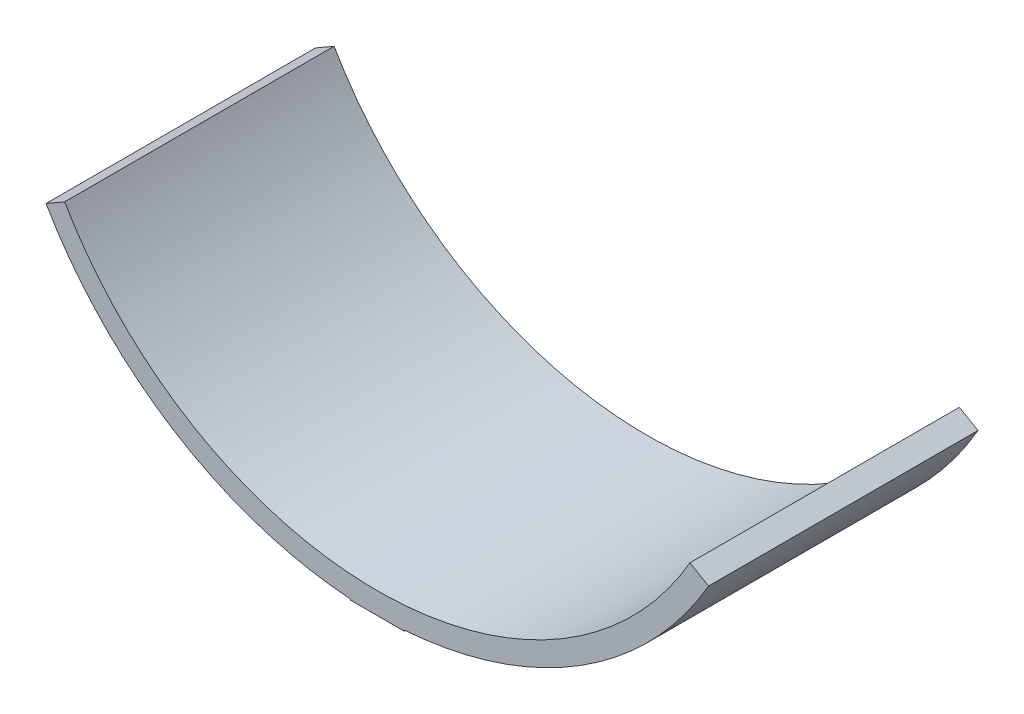
ISO-10303-21;
HEADER;
FILE_DESCRIPTION(('STEP AP214'),'2;1');
FILE_NAME('part.step','',(''),(''),'','','');
FILE_SCHEMA(('AUTOMOTIVE_DESIGN { 1 0 10303 214 1 1 1 1 }'));
ENDSEC;
DATA;
#1=APPLICATION_CONTEXT('core data for automotive mechanical design processes');
#2=APPLICATION_PROTOCOL_DEFINITION('international standard','automotive_design',2000,#1);
#3=PRODUCT_CONTEXT('',#1,'mechanical');
#4=PRODUCT('Part','Part','',(#3));
#5=PRODUCT_RELATED_PRODUCT_CATEGORY('part','',(#4));
#6=PRODUCT_DEFINITION_FORMATION('','',#4);
#7=PRODUCT_DEFINITION_CONTEXT('part definition',#1,'design');
#8=PRODUCT_DEFINITION('design','',#6,#7);
#9=PRODUCT_DEFINITION_SHAPE('','',#8);
#10=(LENGTH_UNIT() NAMED_UNIT(*) SI_UNIT(.MILLI.,.METRE.));
#11=(NAMED_UNIT(*) PLANE_ANGLE_UNIT() SI_UNIT($,.RADIAN.));
#12=(NAMED_UNIT(*) SI_UNIT($,.STERADIAN.) SOLID_ANGLE_UNIT());
#13=UNCERTAINTY_MEASURE_WITH_UNIT(LENGTH_MEASURE(1.E-05),#10,'distance_accuracy_value','');
#14=(GEOMETRIC_REPRESENTATION_CONTEXT(3) GLOBAL_UNCERTAINTY_ASSIGNED_CONTEXT((#13)) GLOBAL_UNIT_ASSIGNED_CONTEXT((#10,
#11,#12)) REPRESENTATION_CONTEXT('',''));
#15=CARTESIAN_POINT('',(0.,0.,0.));
#16=DIRECTION('',(0.,0.,1.));
#17=DIRECTION('',(1.,0.,0.));
#18=AXIS2_PLACEMENT_3D('',#15,#16,#17);
#19=CARTESIAN_POINT('',(0.,87.63,63.5));
#20=DIRECTION('',(0.,0.,-1.));
#21=DIRECTION('',(-1.,0.,0.));
#22=AXIS2_PLACEMENT_3D('',#19,#20,#21);
#23=CYLINDRICAL_SURFACE('',#22,85.09);
#24=CARTESIAN_POINT('',(0.,87.63,0.));
#25=DIRECTION('',(0.,0.,1.));
#26=DIRECTION('',(1.,0.,0.));
#27=AXIS2_PLACEMENT_3D('',#24,#25,#26);
#28=CIRCLE('',#27,85.09);
#29=CARTESIAN_POINT('',(-73.6901016080177,45.0849999999996,0.));
#30=VERTEX_POINT('',#29);
#31=CARTESIAN_POINT('',(73.6901016080177,45.0849999999997,0.));
#32=VERTEX_POINT('',#31);
#33=EDGE_CURVE('E137',#30,#32,#28,.T.);
#34=ORIENTED_EDGE('',*,*,#33,.F.);
#35=DIRECTION('',(0.,0.,-1.));
#36=VECTOR('',#35,1.);
#37=CARTESIAN_POINT('',(-73.6901016080177,45.0849999999996,63.5));
#38=LINE('',#37,#36);
#39=CARTESIAN_POINT('',(-73.6901016080177,45.0849999999996,63.5));
#40=VERTEX_POINT('',#39);
#41=EDGE_CURVE('E11',#40,#30,#38,.T.);
#42=ORIENTED_EDGE('',*,*,#41,.F.);
#43=CARTESIAN_POINT('',(0.,87.63,63.5));
#44=DIRECTION('',(0.,0.,1.));
#45=DIRECTION('',(1.,0.,0.));
#46=AXIS2_PLACEMENT_3D('',#43,#44,#45);
#47=CIRCLE('',#46,85.09);
#48=CARTESIAN_POINT('',(73.6901016080177,45.0849999999997,63.5));
#49=VERTEX_POINT('',#48);
#50=EDGE_CURVE('E154',#40,#49,#47,.T.);
#51=ORIENTED_EDGE('',*,*,#50,.T.);
#52=DIRECTION('',(0.,0.,-1.));
#53=VECTOR('',#52,1.);
#54=CARTESIAN_POINT('',(73.6901016080177,45.0849999999997,63.5));
#55=LINE('',#54,#53);
#56=EDGE_CURVE('E94',#49,#32,#55,.T.);
#57=ORIENTED_EDGE('',*,*,#56,.T.);
#58=EDGE_LOOP('',(#34,#42,#51,#57));
#59=FACE_BOUND('',#58,.T.);
#60=ADVANCED_FACE('F43',(#59),#23,.F.);
#61=CARTESIAN_POINT('',(-37.9449030668156,65.7224999999996,63.5));
#62=DIRECTION('',(0.500000000000007,-0.866025403784435,0.));
#63=DIRECTION('',(0.866025403784435,0.500000000000007,0.));
#64=AXIS2_PLACEMENT_3D('',#61,#62,#63);
#65=PLANE('',#64);
#66=DIRECTION('',(-0.866025403784435,-0.500000000000007,0.));
#67=VECTOR('',#66,1.);
#68=CARTESIAN_POINT('',(-37.9449030668156,65.7224999999996,0.));
#69=LINE('',#68,#67);
#70=CARTESIAN_POINT('',(-78.0895106592426,42.5449999999996,0.));
#71=VERTEX_POINT('',#70);
#72=EDGE_CURVE('E140',#30,#71,#69,.T.);
#73=ORIENTED_EDGE('',*,*,#72,.T.);
#74=DIRECTION('',(0.,0.,-1.));
#75=VECTOR('',#74,1.);
#76=CARTESIAN_POINT('',(-78.0895106592426,42.5449999999996,63.5));
#77=LINE('',#76,#75);
#78=CARTESIAN_POINT('',(-78.0895106592426,42.5449999999996,63.5));
#79=VERTEX_POINT('',#78);
#80=EDGE_CURVE('E51',#79,#71,#77,.T.);
#81=ORIENTED_EDGE('',*,*,#80,.F.);
#82=DIRECTION('',(-0.866025403784435,-0.500000000000007,0.));
#83=VECTOR('',#82,1.);
#84=CARTESIAN_POINT('',(-37.9449030668156,65.7224999999996,63.5));
#85=LINE('',#84,#83);
#86=EDGE_CURVE('E180',#40,#79,#85,.T.);
#87=ORIENTED_EDGE('',*,*,#86,.F.);
#88=ORIENTED_EDGE('',*,*,#41,.T.);
#89=EDGE_LOOP('',(#73,#81,#87,#88));
#90=FACE_BOUND('',#89,.T.);
#91=ADVANCED_FACE('F184',(#90),#65,.F.);
#92=CARTESIAN_POINT('',(0.,87.63,63.5));
#93=DIRECTION('',(0.,0.,-1.));
#94=DIRECTION('',(-1.,0.,0.));
#95=AXIS2_PLACEMENT_3D('',#92,#93,#94);
#96=CYLINDRICAL_SURFACE('',#95,90.17);
#97=CARTESIAN_POINT('',(0.,87.63,0.));
#98=DIRECTION('',(0.,0.,1.));
#99=DIRECTION('',(1.,0.,0.));
#100=AXIS2_PLACEMENT_3D('',#97,#98,#99);
#101=CIRCLE('',#100,90.17);
#102=CARTESIAN_POINT('',(-6.35,-2.31613054489893,0.));
#103=VERTEX_POINT('',#102);
#104=EDGE_CURVE('E142',#71,#103,#101,.T.);
#105=ORIENTED_EDGE('',*,*,#104,.T.);
#106=DIRECTION('',(0.,0.,-1.));
#107=VECTOR('',#106,1.);
#108=CARTESIAN_POINT('',(-6.35,-2.31613054489893,63.5));
#109=LINE('',#108,#107);
#110=CARTESIAN_POINT('',(-6.35,-2.31613054489893,63.5));
#111=VERTEX_POINT('',#110);
#112=EDGE_CURVE('E160',#111,#103,#109,.T.);
#113=ORIENTED_EDGE('',*,*,#112,.F.);
#114=CARTESIAN_POINT('',(0.,87.63,63.5));
#115=DIRECTION('',(0.,0.,1.));
#116=DIRECTION('',(1.,0.,0.));
#117=AXIS2_PLACEMENT_3D('',#114,#115,#116);
#118=CIRCLE('',#117,90.17);
#119=EDGE_CURVE('E168',#79,#111,#118,.T.);
#120=ORIENTED_EDGE('',*,*,#119,.F.);
#121=ORIENTED_EDGE('',*,*,#80,.T.);
#122=EDGE_LOOP('',(#105,#113,#120,#121));
#123=FACE_BOUND('',#122,.T.);
#124=ADVANCED_FACE('F166',(#123),#96,.T.);
#125=CARTESIAN_POINT('',(-6.35,0.,63.5));
#126=DIRECTION('',(-1.,0.,0.));
#127=DIRECTION('',(0.,0.,1.));
#128=AXIS2_PLACEMENT_3D('',#125,#126,#127);
#129=PLANE('',#128);
#130=DIRECTION('',(0.,1.,0.));
#131=VECTOR('',#130,1.);
#132=CARTESIAN_POINT('',(-6.35,0.,0.));
#133=LINE('',#132,#131);
#134=CARTESIAN_POINT('',(-6.35,-2.54,0.));
#135=VERTEX_POINT('',#134);
#136=EDGE_CURVE('E145',#135,#103,#133,.T.);
#137=ORIENTED_EDGE('',*,*,#136,.F.);
#138=DIRECTION('',(0.,0.,-1.));
#139=VECTOR('',#138,1.);
#140=CARTESIAN_POINT('',(-6.35,-2.54,63.5));
#141=LINE('',#140,#139);
#142=CARTESIAN_POINT('',(-6.35,-2.54,63.5));
#143=VERTEX_POINT('',#142);
#144=EDGE_CURVE('E158',#143,#135,#141,.T.);
#145=ORIENTED_EDGE('',*,*,#144,.F.);
#146=DIRECTION('',(0.,1.,0.));
#147=VECTOR('',#146,1.);
#148=CARTESIAN_POINT('',(-6.35,0.,63.5));
#149=LINE('',#148,#147);
#150=EDGE_CURVE('E178',#143,#111,#149,.T.);
#151=ORIENTED_EDGE('',*,*,#150,.T.);
#152=ORIENTED_EDGE('',*,*,#112,.T.);
#153=EDGE_LOOP('',(#137,#145,#151,#152));
#154=FACE_BOUND('',#153,.T.);
#155=ADVANCED_FACE('F176',(#154),#129,.T.);
#156=CARTESIAN_POINT('',(0.,-2.54,63.5));
#157=DIRECTION('',(0.,1.,0.));
#158=DIRECTION('',(0.,0.,1.));
#159=AXIS2_PLACEMENT_3D('',#156,#157,#158);
#160=PLANE('',#159);
#161=DIRECTION('',(1.,0.,0.));
#162=VECTOR('',#161,1.);
#163=CARTESIAN_POINT('',(0.,-2.54,0.));
#164=LINE('',#163,#162);
#165=CARTESIAN_POINT('',(6.35,-2.54,0.));
#166=VERTEX_POINT('',#165);
#167=EDGE_CURVE('E148',#135,#166,#164,.T.);
#168=ORIENTED_EDGE('',*,*,#167,.T.);
#169=DIRECTION('',(0.,0.,-1.));
#170=VECTOR('',#169,1.);
#171=CARTESIAN_POINT('',(6.35,-2.54,63.5));
#172=LINE('',#171,#170);
#173=CARTESIAN_POINT('',(6.35,-2.54,63.5));
#174=VERTEX_POINT('',#173);
#175=EDGE_CURVE('E129',#174,#166,#172,.T.);
#176=ORIENTED_EDGE('',*,*,#175,.F.);
#177=DIRECTION('',(1.,0.,0.));
#178=VECTOR('',#177,1.);
#179=CARTESIAN_POINT('',(0.,-2.54,63.5));
#180=LINE('',#179,#178);
#181=EDGE_CURVE('E120',#143,#174,#180,.T.);
#182=ORIENTED_EDGE('',*,*,#181,.F.);
#183=ORIENTED_EDGE('',*,*,#144,.T.);
#184=EDGE_LOOP('',(#168,#176,#182,#183));
#185=FACE_BOUND('',#184,.T.);
#186=ADVANCED_FACE('F194',(#185),#160,.F.);
#187=CARTESIAN_POINT('',(6.35,0.,63.5));
#188=DIRECTION('',(-1.,0.,0.));
#189=DIRECTION('',(0.,0.,1.));
#190=AXIS2_PLACEMENT_3D('',#187,#188,#189);
#191=PLANE('',#190);
#192=DIRECTION('',(0.,1.,0.));
#193=VECTOR('',#192,1.);
#194=CARTESIAN_POINT('',(6.35,0.,0.));
#195=LINE('',#194,#193);
#196=CARTESIAN_POINT('',(6.35,-2.31613054489893,0.));
#197=VERTEX_POINT('',#196);
#198=EDGE_CURVE('E128',#166,#197,#195,.T.);
#199=ORIENTED_EDGE('',*,*,#198,.T.);
#200=DIRECTION('',(0.,0.,-1.));
#201=VECTOR('',#200,1.);
#202=CARTESIAN_POINT('',(6.35,-2.31613054489893,63.5));
#203=LINE('',#202,#201);
#204=CARTESIAN_POINT('',(6.35,-2.31613054489893,63.5));
#205=VERTEX_POINT('',#204);
#206=EDGE_CURVE('E125',#205,#197,#203,.T.);
#207=ORIENTED_EDGE('',*,*,#206,.F.);
#208=DIRECTION('',(0.,1.,0.));
#209=VECTOR('',#208,1.);
#210=CARTESIAN_POINT('',(6.35,0.,63.5));
#211=LINE('',#210,#209);
#212=EDGE_CURVE('E113',#174,#205,#211,.T.);
#213=ORIENTED_EDGE('',*,*,#212,.F.);
#214=ORIENTED_EDGE('',*,*,#175,.T.);
#215=EDGE_LOOP('',(#199,#207,#213,#214));
#216=FACE_BOUND('',#215,.T.);
#217=ADVANCED_FACE('F126',(#216),#191,.F.);
#218=CARTESIAN_POINT('',(0.,87.63,63.5));
#219=DIRECTION('',(0.,0.,-1.));
#220=DIRECTION('',(-1.,0.,0.));
#221=AXIS2_PLACEMENT_3D('',#218,#219,#220);
#222=CYLINDRICAL_SURFACE('',#221,90.17);
#223=CARTESIAN_POINT('',(0.,87.63,0.));
#224=DIRECTION('',(0.,0.,1.));
#225=DIRECTION('',(1.,0.,0.));
#226=AXIS2_PLACEMENT_3D('',#223,#224,#225);
#227=CIRCLE('',#226,90.17);
#228=CARTESIAN_POINT('',(78.0895106592426,42.5449999999996,0.));
#229=VERTEX_POINT('',#228);
#230=EDGE_CURVE('E87',#197,#229,#227,.T.);
#231=ORIENTED_EDGE('',*,*,#230,.T.);
#232=DIRECTION('',(0.,0.,-1.));
#233=VECTOR('',#232,1.);
#234=CARTESIAN_POINT('',(78.0895106592426,42.5449999999996,63.5));
#235=LINE('',#234,#233);
#236=CARTESIAN_POINT('',(78.0895106592426,42.5449999999996,63.5));
#237=VERTEX_POINT('',#236);
#238=EDGE_CURVE('E130',#237,#229,#235,.T.);
#239=ORIENTED_EDGE('',*,*,#238,.F.);
#240=CARTESIAN_POINT('',(0.,87.63,63.5));
#241=DIRECTION('',(0.,0.,1.));
#242=DIRECTION('',(1.,0.,0.));
#243=AXIS2_PLACEMENT_3D('',#240,#241,#242);
#244=CIRCLE('',#243,90.17);
#245=EDGE_CURVE('E117',#205,#237,#244,.T.);
#246=ORIENTED_EDGE('',*,*,#245,.F.);
#247=ORIENTED_EDGE('',*,*,#206,.T.);
#248=EDGE_LOOP('',(#231,#239,#246,#247));
#249=FACE_BOUND('',#248,.T.);
#250=ADVANCED_FACE('F132',(#249),#222,.T.);
#251=CARTESIAN_POINT('',(37.9449030668157,65.7224999999997,63.5));
#252=DIRECTION('',(-0.500000000000007,-0.866025403784434,0.));
#253=DIRECTION('',(0.866025403784434,-0.500000000000007,0.));
#254=AXIS2_PLACEMENT_3D('',#251,#252,#253);
#255=PLANE('',#254);
#256=DIRECTION('',(-0.866025403784434,0.500000000000007,0.));
#257=VECTOR('',#256,1.);
#258=CARTESIAN_POINT('',(37.9449030668157,65.7224999999997,0.));
#259=LINE('',#258,#257);
#260=EDGE_CURVE('E152',#229,#32,#259,.T.);
#261=ORIENTED_EDGE('',*,*,#260,.T.);
#262=ORIENTED_EDGE('',*,*,#56,.F.);
#263=DIRECTION('',(-0.866025403784434,0.500000000000007,0.));
#264=VECTOR('',#263,1.);
#265=CARTESIAN_POINT('',(37.9449030668157,65.7224999999997,63.5));
#266=LINE('',#265,#264);
#267=EDGE_CURVE('E59',#237,#49,#266,.T.);
#268=ORIENTED_EDGE('',*,*,#267,.F.);
#269=ORIENTED_EDGE('',*,*,#238,.T.);
#270=EDGE_LOOP('',(#261,#262,#268,#269));
#271=FACE_BOUND('',#270,.T.);
#272=ADVANCED_FACE('F202',(#271),#255,.F.);
#273=CARTESIAN_POINT('',(0.,0.,63.5));
#274=DIRECTION('',(0.,0.,1.));
#275=DIRECTION('',(1.,0.,0.));
#276=AXIS2_PLACEMENT_3D('',#273,#274,#275);
#277=PLANE('',#276);
#278=ORIENTED_EDGE('',*,*,#50,.F.);
#279=ORIENTED_EDGE('',*,*,#86,.T.);
#280=ORIENTED_EDGE('',*,*,#119,.T.);
#281=ORIENTED_EDGE('',*,*,#150,.F.);
#282=ORIENTED_EDGE('',*,*,#181,.T.);
#283=ORIENTED_EDGE('',*,*,#212,.T.);
#284=ORIENTED_EDGE('',*,*,#245,.T.);
#285=ORIENTED_EDGE('',*,*,#267,.T.);
#286=EDGE_LOOP('',(#278,#279,#280,#281,#282,#283,#284,#285));
#287=FACE_BOUND('',#286,.T.);
#288=ADVANCED_FACE('F115',(#287),#277,.T.);
#289=CARTESIAN_POINT('',(0.,0.,0.));
#290=DIRECTION('',(0.,0.,1.));
#291=DIRECTION('',(1.,0.,0.));
#292=AXIS2_PLACEMENT_3D('',#289,#290,#291);
#293=PLANE('',#292);
#294=ORIENTED_EDGE('',*,*,#33,.T.);
#295=ORIENTED_EDGE('',*,*,#260,.F.);
#296=ORIENTED_EDGE('',*,*,#230,.F.);
#297=ORIENTED_EDGE('',*,*,#198,.F.);
#298=ORIENTED_EDGE('',*,*,#167,.F.);
#299=ORIENTED_EDGE('',*,*,#136,.T.);
#300=ORIENTED_EDGE('',*,*,#104,.F.);
#301=ORIENTED_EDGE('',*,*,#72,.F.);
#302=EDGE_LOOP('',(#294,#295,#296,#297,#298,#299,#300,#301));
#303=FACE_BOUND('',#302,.T.);
#304=ADVANCED_FACE('F172',(#303),#293,.F.);
#305=CLOSED_SHELL('',(#60,#91,#124,#155,#186,#217,#250,#272,#288,#304));
#306=MANIFOLD_SOLID_BREP('B2',#305);
#307=ADVANCED_BREP_SHAPE_REPRESENTATION('',(#18,#306),#14);
#308=SHAPE_DEFINITION_REPRESENTATION(#9,#307);
ENDSEC;
END-ISO-10303-21;
